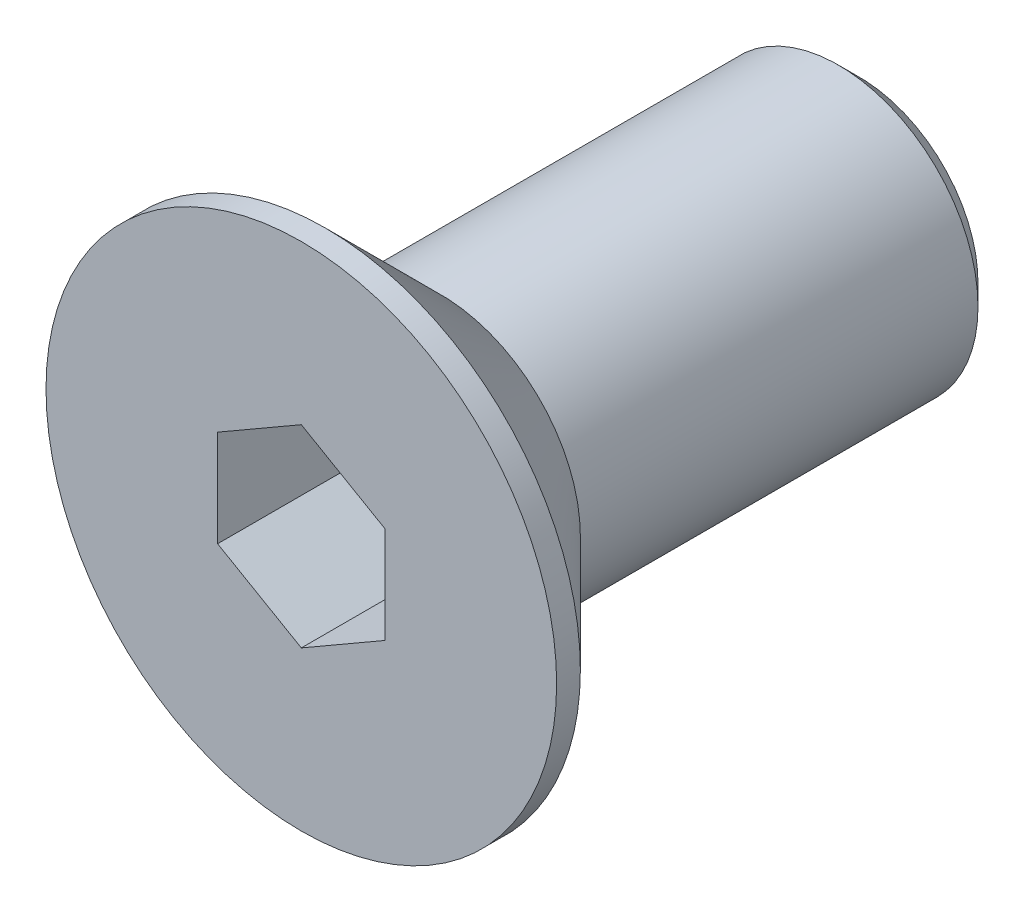
ISO-10303-21;
HEADER;
FILE_DESCRIPTION(('STEP AP214'),'2;1');
FILE_NAME('part.step','',(''),(''),'','','');
FILE_SCHEMA(('AUTOMOTIVE_DESIGN { 1 0 10303 214 1 1 1 1 }'));
ENDSEC;
DATA;
#1=APPLICATION_CONTEXT('core data for automotive mechanical design processes');
#2=APPLICATION_PROTOCOL_DEFINITION('international standard','automotive_design',2000,#1);
#3=PRODUCT_CONTEXT('',#1,'mechanical');
#4=PRODUCT('Part','Part','',(#3));
#5=PRODUCT_RELATED_PRODUCT_CATEGORY('part','',(#4));
#6=PRODUCT_DEFINITION_FORMATION('','',#4);
#7=PRODUCT_DEFINITION_CONTEXT('part definition',#1,'design');
#8=PRODUCT_DEFINITION('design','',#6,#7);
#9=PRODUCT_DEFINITION_SHAPE('','',#8);
#10=(LENGTH_UNIT() NAMED_UNIT(*) SI_UNIT(.MILLI.,.METRE.));
#11=(NAMED_UNIT(*) PLANE_ANGLE_UNIT() SI_UNIT($,.RADIAN.));
#12=(NAMED_UNIT(*) SI_UNIT($,.STERADIAN.) SOLID_ANGLE_UNIT());
#13=UNCERTAINTY_MEASURE_WITH_UNIT(LENGTH_MEASURE(1.E-05),#10,'distance_accuracy_value','');
#14=(GEOMETRIC_REPRESENTATION_CONTEXT(3) GLOBAL_UNCERTAINTY_ASSIGNED_CONTEXT((#13)) GLOBAL_UNIT_ASSIGNED_CONTEXT((#10,
#11,#12)) REPRESENTATION_CONTEXT('',''));
#15=CARTESIAN_POINT('',(0.,0.,0.));
#16=DIRECTION('',(0.,0.,1.));
#17=DIRECTION('',(1.,0.,0.));
#18=AXIS2_PLACEMENT_3D('',#15,#16,#17);
#19=CARTESIAN_POINT('',(0.,0.,-15.));
#20=DIRECTION('',(0.,0.,-1.));
#21=DIRECTION('',(-1.,0.,0.));
#22=AXIS2_PLACEMENT_3D('',#19,#20,#21);
#23=PLANE('',#22);
#24=CARTESIAN_POINT('',(0.,0.,-15.0000000000432));
#25=DIRECTION('',(0.,0.,1.));
#26=DIRECTION('',(0.,-1.,0.));
#27=AXIS2_PLACEMENT_3D('',#24,#25,#26);
#28=CIRCLE('',#27,4.24999999995634);
#29=CARTESIAN_POINT('',(0.,-4.24999999995634,-15.0000000000432));
#30=VERTEX_POINT('',#29);
#31=EDGE_CURVE('E19',#30,#30,#28,.T.);
#32=ORIENTED_EDGE('',*,*,#31,.F.);
#33=EDGE_LOOP('',(#32));
#34=FACE_BOUND('',#33,.T.);
#35=ADVANCED_FACE('F16',(#34),#23,.T.);
#36=CARTESIAN_POINT('',(0.,0.,-14.2500000001178));
#37=DIRECTION('',(0.,0.,1.));
#38=DIRECTION('',(0.,-1.,0.));
#39=AXIS2_PLACEMENT_3D('',#36,#37,#38);
#40=CONICAL_SURFACE('',#39,4.99999999988177,0.785398163397448);
#41=CARTESIAN_POINT('',(0.,0.,-14.25));
#42=DIRECTION('',(0.,0.,1.));
#43=DIRECTION('',(1.,0.,0.));
#44=AXIS2_PLACEMENT_3D('',#41,#42,#43);
#45=CIRCLE('',#44,5.);
#46=CARTESIAN_POINT('',(5.,0.,-14.25));
#47=VERTEX_POINT('',#46);
#48=EDGE_CURVE('E101',#47,#47,#45,.T.);
#49=ORIENTED_EDGE('',*,*,#48,.F.);
#50=EDGE_LOOP('',(#49));
#51=FACE_BOUND('',#50,.T.);
#52=ORIENTED_EDGE('',*,*,#31,.T.);
#53=EDGE_LOOP('',(#52));
#54=FACE_BOUND('',#53,.T.);
#55=ADVANCED_FACE('F108',(#51,#54),#40,.T.);
#56=CARTESIAN_POINT('',(0.,0.,0.));
#57=DIRECTION('',(0.,0.,1.));
#58=DIRECTION('',(1.,0.,0.));
#59=AXIS2_PLACEMENT_3D('',#56,#57,#58);
#60=CYLINDRICAL_SURFACE('',#59,5.);
#61=CARTESIAN_POINT('',(0.,0.,-2.61483543151364E-11));
#62=DIRECTION('',(0.,0.,1.));
#63=DIRECTION('',(1.,0.,0.));
#64=AXIS2_PLACEMENT_3D('',#61,#62,#63);
#65=CIRCLE('',#64,5.00000000002615);
#66=CARTESIAN_POINT('',(5.00000000002615,0.,-2.61483543151364E-11));
#67=VERTEX_POINT('',#66);
#68=EDGE_CURVE('E79',#67,#67,#65,.T.);
#69=ORIENTED_EDGE('',*,*,#68,.F.);
#70=EDGE_LOOP('',(#69));
#71=FACE_BOUND('',#70,.T.);
#72=ORIENTED_EDGE('',*,*,#48,.T.);
#73=EDGE_LOOP('',(#72));
#74=FACE_BOUND('',#73,.T.);
#75=ADVANCED_FACE('F115',(#71,#74),#60,.T.);
#76=CARTESIAN_POINT('',(3.,1.73205080756888,0.5));
#77=DIRECTION('',(0.,0.,1.));
#78=DIRECTION('',(1.,0.,0.));
#79=AXIS2_PLACEMENT_3D('',#76,#77,#78);
#80=PLANE('',#79);
#81=DIRECTION('',(0.866025403784439,0.5,0.));
#82=VECTOR('',#81,1.);
#83=CARTESIAN_POINT('',(0.,3.46410161513775,0.499999999999987));
#84=LINE('',#83,#82);
#85=CARTESIAN_POINT('',(-3.,1.73205080756888,0.499999999999998));
#86=VERTEX_POINT('',#85);
#87=CARTESIAN_POINT('',(0.,3.46410161513775,0.499999999999993));
#88=VERTEX_POINT('',#87);
#89=EDGE_CURVE('E65',#86,#88,#84,.T.);
#90=ORIENTED_EDGE('',*,*,#89,.F.);
#91=DIRECTION('',(0.,1.,0.));
#92=VECTOR('',#91,1.);
#93=CARTESIAN_POINT('',(-3.,1.73205080756888,0.5));
#94=LINE('',#93,#92);
#95=CARTESIAN_POINT('',(-3.,-1.73205080756888,0.499999999999998));
#96=VERTEX_POINT('',#95);
#97=EDGE_CURVE('E70',#96,#86,#94,.T.);
#98=ORIENTED_EDGE('',*,*,#97,.F.);
#99=DIRECTION('',(-0.866025403784439,0.5,0.));
#100=VECTOR('',#99,1.);
#101=CARTESIAN_POINT('',(-3.,-1.73205080756888,0.499999999999987));
#102=LINE('',#101,#100);
#103=CARTESIAN_POINT('',(0.,-3.46410161513775,0.499999999999993));
#104=VERTEX_POINT('',#103);
#105=EDGE_CURVE('E98',#104,#96,#102,.T.);
#106=ORIENTED_EDGE('',*,*,#105,.F.);
#107=DIRECTION('',(-0.866025403784439,-0.5,0.));
#108=VECTOR('',#107,1.);
#109=CARTESIAN_POINT('',(0.,-3.46410161513775,0.499999999999987));
#110=LINE('',#109,#108);
#111=CARTESIAN_POINT('',(3.,-1.73205080756888,0.499999999999998));
#112=VERTEX_POINT('',#111);
#113=EDGE_CURVE('E226',#112,#104,#110,.T.);
#114=ORIENTED_EDGE('',*,*,#113,.F.);
#115=DIRECTION('',(0.,-1.,0.));
#116=VECTOR('',#115,1.);
#117=CARTESIAN_POINT('',(3.,-1.73205080756888,0.5));
#118=LINE('',#117,#116);
#119=CARTESIAN_POINT('',(3.,1.73205080756888,0.499999999999995));
#120=VERTEX_POINT('',#119);
#121=EDGE_CURVE('E221',#120,#112,#118,.T.);
#122=ORIENTED_EDGE('',*,*,#121,.F.);
#123=DIRECTION('',(0.866025403784439,-0.5,0.));
#124=VECTOR('',#123,1.);
#125=CARTESIAN_POINT('',(3.,1.73205080756888,0.499999999999987));
#126=LINE('',#125,#124);
#127=EDGE_CURVE('E83',#88,#120,#126,.T.);
#128=ORIENTED_EDGE('',*,*,#127,.F.);
#129=EDGE_LOOP('',(#90,#98,#106,#114,#122,#128));
#130=FACE_BOUND('',#129,.T.);
#131=ADVANCED_FACE('F81',(#130),#80,.T.);
#132=CARTESIAN_POINT('',(0.,0.,4.14999999998145));
#133=DIRECTION('',(0.,0.,1.));
#134=DIRECTION('',(1.,0.,0.));
#135=AXIS2_PLACEMENT_3D('',#132,#133,#134);
#136=CONICAL_SURFACE('',#135,9.1499999999769,0.7853981633906);
#137=CARTESIAN_POINT('',(0.,0.,4.14999999998145));
#138=DIRECTION('',(0.,0.,1.));
#139=DIRECTION('',(1.,0.,0.));
#140=AXIS2_PLACEMENT_3D('',#137,#138,#139);
#141=CIRCLE('',#140,9.15);
#142=CARTESIAN_POINT('',(9.15,0.,4.14999999998145));
#143=VERTEX_POINT('',#142);
#144=EDGE_CURVE('E94',#143,#143,#141,.T.);
#145=ORIENTED_EDGE('',*,*,#144,.F.);
#146=EDGE_LOOP('',(#145));
#147=FACE_BOUND('',#146,.T.);
#148=ORIENTED_EDGE('',*,*,#68,.T.);
#149=EDGE_LOOP('',(#148));
#150=FACE_BOUND('',#149,.T.);
#151=ADVANCED_FACE('F148',(#147,#150),#136,.T.);
#152=CARTESIAN_POINT('',(-3.,1.73205080756888,33.2074914965975));
#153=DIRECTION('',(1.,0.,0.));
#154=DIRECTION('',(0.,1.,0.));
#155=AXIS2_PLACEMENT_3D('',#152,#153,#154);
#156=PLANE('',#155);
#157=DIRECTION('',(0.,0.,1.));
#158=VECTOR('',#157,1.);
#159=CARTESIAN_POINT('',(-3.,-1.73205080756888,33.2074914965975));
#160=LINE('',#159,#158);
#161=CARTESIAN_POINT('',(-3.,-1.73205080756888,5.));
#162=VERTEX_POINT('',#161);
#163=EDGE_CURVE('E75',#96,#162,#160,.T.);
#164=ORIENTED_EDGE('',*,*,#163,.F.);
#165=ORIENTED_EDGE('',*,*,#97,.T.);
#166=DIRECTION('',(0.,0.,1.));
#167=VECTOR('',#166,1.);
#168=CARTESIAN_POINT('',(-3.,1.73205080756887,33.2074914965975));
#169=LINE('',#168,#167);
#170=CARTESIAN_POINT('',(-3.,1.73205080756888,5.));
#171=VERTEX_POINT('',#170);
#172=EDGE_CURVE('E72',#171,#86,#169,.F.);
#173=ORIENTED_EDGE('',*,*,#172,.F.);
#174=DIRECTION('',(0.,1.,0.));
#175=VECTOR('',#174,1.);
#176=CARTESIAN_POINT('',(-3.,0.,5.));
#177=LINE('',#176,#175);
#178=EDGE_CURVE('E97',#162,#171,#177,.T.);
#179=ORIENTED_EDGE('',*,*,#178,.F.);
#180=EDGE_LOOP('',(#164,#165,#173,#179));
#181=FACE_BOUND('',#180,.T.);
#182=ADVANCED_FACE('F71',(#181),#156,.T.);
#183=CARTESIAN_POINT('',(0.,3.46410161513775,33.2074914965975));
#184=DIRECTION('',(0.5,-0.866025403784439,0.));
#185=DIRECTION('',(0.866025403784439,0.5,0.));
#186=AXIS2_PLACEMENT_3D('',#183,#184,#185);
#187=PLANE('',#186);
#188=ORIENTED_EDGE('',*,*,#172,.T.);
#189=ORIENTED_EDGE('',*,*,#89,.T.);
#190=DIRECTION('',(0.,0.,1.));
#191=VECTOR('',#190,1.);
#192=CARTESIAN_POINT('',(0.,3.46410161513776,33.2074914965975));
#193=LINE('',#192,#191);
#194=CARTESIAN_POINT('',(0.,3.46410161513775,4.99999999999999));
#195=VERTEX_POINT('',#194);
#196=EDGE_CURVE('E85',#195,#88,#193,.F.);
#197=ORIENTED_EDGE('',*,*,#196,.F.);
#198=DIRECTION('',(0.866025403784439,0.499999999999999,0.));
#199=VECTOR('',#198,1.);
#200=CARTESIAN_POINT('',(-3.,1.73205080756888,5.));
#201=LINE('',#200,#199);
#202=EDGE_CURVE('E89',#171,#195,#201,.T.);
#203=ORIENTED_EDGE('',*,*,#202,.F.);
#204=EDGE_LOOP('',(#188,#189,#197,#203));
#205=FACE_BOUND('',#204,.T.);
#206=ADVANCED_FACE('F87',(#205),#187,.T.);
#207=CARTESIAN_POINT('',(3.,1.73205080756888,33.2074914965975));
#208=DIRECTION('',(-0.5,-0.866025403784439,0.));
#209=DIRECTION('',(0.866025403784439,-0.5,0.));
#210=AXIS2_PLACEMENT_3D('',#207,#208,#209);
#211=PLANE('',#210);
#212=ORIENTED_EDGE('',*,*,#196,.T.);
#213=ORIENTED_EDGE('',*,*,#127,.T.);
#214=DIRECTION('',(0.,0.,1.));
#215=VECTOR('',#214,1.);
#216=CARTESIAN_POINT('',(3.,1.73205080756888,33.2074914965975));
#217=LINE('',#216,#215);
#218=CARTESIAN_POINT('',(3.,1.73205080756888,4.99999999999999));
#219=VERTEX_POINT('',#218);
#220=EDGE_CURVE('E216',#219,#120,#217,.F.);
#221=ORIENTED_EDGE('',*,*,#220,.F.);
#222=DIRECTION('',(0.866025403784439,-0.499999999999999,0.));
#223=VECTOR('',#222,1.);
#224=CARTESIAN_POINT('',(0.,3.46410161513775,5.));
#225=LINE('',#224,#223);
#226=EDGE_CURVE('E215',#195,#219,#225,.T.);
#227=ORIENTED_EDGE('',*,*,#226,.F.);
#228=EDGE_LOOP('',(#212,#213,#221,#227));
#229=FACE_BOUND('',#228,.T.);
#230=ADVANCED_FACE('F139',(#229),#211,.T.);
#231=CARTESIAN_POINT('',(3.,-1.73205080756888,33.2074914965975));
#232=DIRECTION('',(-1.,0.,0.));
#233=DIRECTION('',(0.,-1.,0.));
#234=AXIS2_PLACEMENT_3D('',#231,#232,#233);
#235=PLANE('',#234);
#236=ORIENTED_EDGE('',*,*,#220,.T.);
#237=ORIENTED_EDGE('',*,*,#121,.T.);
#238=DIRECTION('',(0.,0.,1.));
#239=VECTOR('',#238,1.);
#240=CARTESIAN_POINT('',(3.,-1.73205080756887,33.2074914965975));
#241=LINE('',#240,#239);
#242=CARTESIAN_POINT('',(3.,-1.73205080756888,5.));
#243=VERTEX_POINT('',#242);
#244=EDGE_CURVE('E223',#243,#112,#241,.F.);
#245=ORIENTED_EDGE('',*,*,#244,.F.);
#246=DIRECTION('',(0.,1.,0.));
#247=VECTOR('',#246,1.);
#248=CARTESIAN_POINT('',(3.,0.,5.));
#249=LINE('',#248,#247);
#250=EDGE_CURVE('E234',#219,#243,#249,.F.);
#251=ORIENTED_EDGE('',*,*,#250,.F.);
#252=EDGE_LOOP('',(#236,#237,#245,#251));
#253=FACE_BOUND('',#252,.T.);
#254=ADVANCED_FACE('F136',(#253),#235,.T.);
#255=CARTESIAN_POINT('',(0.,-3.46410161513775,33.2074914965975));
#256=DIRECTION('',(-0.5,0.866025403784439,0.));
#257=DIRECTION('',(-0.866025403784439,-0.5,0.));
#258=AXIS2_PLACEMENT_3D('',#255,#256,#257);
#259=PLANE('',#258);
#260=ORIENTED_EDGE('',*,*,#244,.T.);
#261=ORIENTED_EDGE('',*,*,#113,.T.);
#262=DIRECTION('',(0.,0.,1.));
#263=VECTOR('',#262,1.);
#264=CARTESIAN_POINT('',(0.,-3.46410161513776,33.2074914965975));
#265=LINE('',#264,#263);
#266=CARTESIAN_POINT('',(0.,-3.46410161513775,4.99999999999999));
#267=VERTEX_POINT('',#266);
#268=EDGE_CURVE('E33',#267,#104,#265,.F.);
#269=ORIENTED_EDGE('',*,*,#268,.F.);
#270=DIRECTION('',(-0.866025403784439,-0.499999999999999,0.));
#271=VECTOR('',#270,1.);
#272=CARTESIAN_POINT('',(3.,-1.73205080756888,5.));
#273=LINE('',#272,#271);
#274=EDGE_CURVE('E237',#243,#267,#273,.T.);
#275=ORIENTED_EDGE('',*,*,#274,.F.);
#276=EDGE_LOOP('',(#260,#261,#269,#275));
#277=FACE_BOUND('',#276,.T.);
#278=ADVANCED_FACE('F132',(#277),#259,.T.);
#279=CARTESIAN_POINT('',(-3.,-1.73205080756888,33.2074914965975));
#280=DIRECTION('',(0.5,0.866025403784439,0.));
#281=DIRECTION('',(-0.866025403784439,0.5,0.));
#282=AXIS2_PLACEMENT_3D('',#279,#280,#281);
#283=PLANE('',#282);
#284=ORIENTED_EDGE('',*,*,#268,.T.);
#285=ORIENTED_EDGE('',*,*,#105,.T.);
#286=ORIENTED_EDGE('',*,*,#163,.T.);
#287=DIRECTION('',(-0.866025403784439,0.499999999999999,0.));
#288=VECTOR('',#287,1.);
#289=CARTESIAN_POINT('',(0.,-3.46410161513775,5.));
#290=LINE('',#289,#288);
#291=EDGE_CURVE('E25',#267,#162,#290,.T.);
#292=ORIENTED_EDGE('',*,*,#291,.F.);
#293=EDGE_LOOP('',(#284,#285,#286,#292));
#294=FACE_BOUND('',#293,.T.);
#295=ADVANCED_FACE('F125',(#294),#283,.T.);
#296=CARTESIAN_POINT('',(0.,0.,0.));
#297=DIRECTION('',(0.,0.,1.));
#298=DIRECTION('',(1.,0.,0.));
#299=AXIS2_PLACEMENT_3D('',#296,#297,#298);
#300=CYLINDRICAL_SURFACE('',#299,9.15);
#301=CARTESIAN_POINT('',(0.,0.,5.));
#302=DIRECTION('',(0.,0.,1.));
#303=DIRECTION('',(1.,0.,0.));
#304=AXIS2_PLACEMENT_3D('',#301,#302,#303);
#305=CIRCLE('',#304,9.15);
#306=CARTESIAN_POINT('',(9.15,0.,5.));
#307=VERTEX_POINT('',#306);
#308=EDGE_CURVE('E11',#307,#307,#305,.T.);
#309=ORIENTED_EDGE('',*,*,#308,.F.);
#310=EDGE_LOOP('',(#309));
#311=FACE_BOUND('',#310,.T.);
#312=ORIENTED_EDGE('',*,*,#144,.T.);
#313=EDGE_LOOP('',(#312));
#314=FACE_BOUND('',#313,.T.);
#315=ADVANCED_FACE('F119',(#311,#314),#300,.T.);
#316=CARTESIAN_POINT('',(9.15,0.,5.));
#317=DIRECTION('',(0.,0.,1.));
#318=DIRECTION('',(1.,0.,0.));
#319=AXIS2_PLACEMENT_3D('',#316,#317,#318);
#320=PLANE('',#319);
#321=ORIENTED_EDGE('',*,*,#308,.T.);
#322=EDGE_LOOP('',(#321));
#323=FACE_BOUND('',#322,.T.);
#324=ORIENTED_EDGE('',*,*,#274,.T.);
#325=ORIENTED_EDGE('',*,*,#291,.T.);
#326=ORIENTED_EDGE('',*,*,#178,.T.);
#327=ORIENTED_EDGE('',*,*,#202,.T.);
#328=ORIENTED_EDGE('',*,*,#226,.T.);
#329=ORIENTED_EDGE('',*,*,#250,.T.);
#330=EDGE_LOOP('',(#324,#325,#326,#327,#328,#329));
#331=FACE_BOUND('',#330,.T.);
#332=ADVANCED_FACE('F117',(#323,#331),#320,.T.);
#333=CLOSED_SHELL('',(#35,#55,#75,#131,#151,#182,#206,#230,#254,#278,#295,#315,#332));
#334=MANIFOLD_SOLID_BREP('B1',#333);
#335=ADVANCED_BREP_SHAPE_REPRESENTATION('',(#18,#334),#14);
#336=SHAPE_DEFINITION_REPRESENTATION(#9,#335);
ENDSEC;
END-ISO-10303-21;
